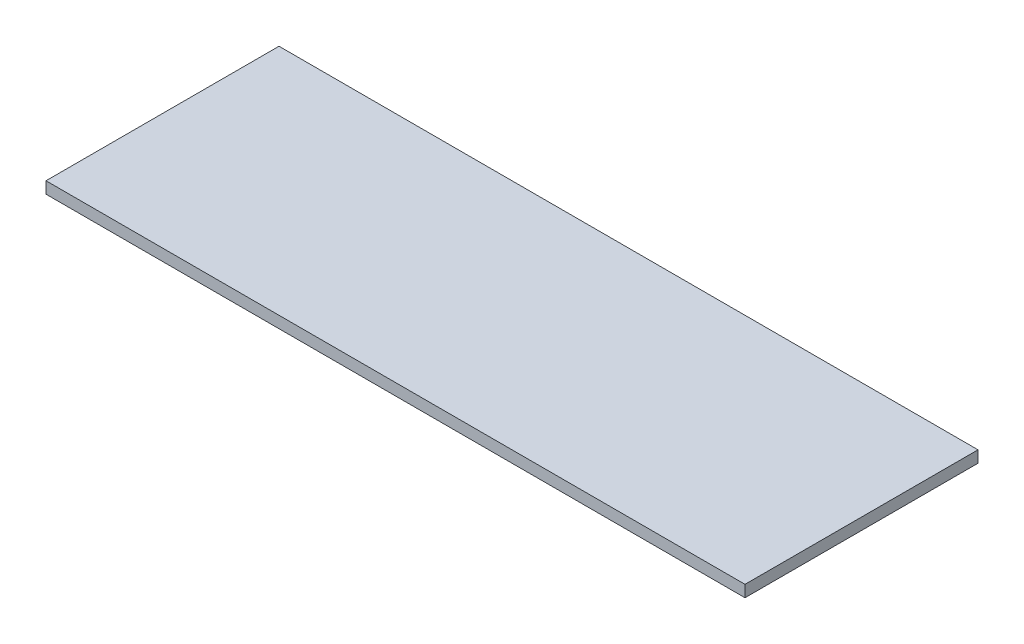
ISO-10303-21;
HEADER;
FILE_DESCRIPTION(('STEP AP214'),'2;1');
FILE_NAME('part.step','',(''),(''),'','','');
FILE_SCHEMA(('AUTOMOTIVE_DESIGN { 1 0 10303 214 1 1 1 1 }'));
ENDSEC;
DATA;
#1=APPLICATION_CONTEXT('core data for automotive mechanical design processes');
#2=APPLICATION_PROTOCOL_DEFINITION('international standard','automotive_design',2000,#1);
#3=PRODUCT_CONTEXT('',#1,'mechanical');
#4=PRODUCT('Part','Part','',(#3));
#5=PRODUCT_RELATED_PRODUCT_CATEGORY('part','',(#4));
#6=PRODUCT_DEFINITION_FORMATION('','',#4);
#7=PRODUCT_DEFINITION_CONTEXT('part definition',#1,'design');
#8=PRODUCT_DEFINITION('design','',#6,#7);
#9=PRODUCT_DEFINITION_SHAPE('','',#8);
#10=(LENGTH_UNIT() NAMED_UNIT(*) SI_UNIT(.MILLI.,.METRE.));
#11=(NAMED_UNIT(*) PLANE_ANGLE_UNIT() SI_UNIT($,.RADIAN.));
#12=(NAMED_UNIT(*) SI_UNIT($,.STERADIAN.) SOLID_ANGLE_UNIT());
#13=UNCERTAINTY_MEASURE_WITH_UNIT(LENGTH_MEASURE(1.E-05),#10,'distance_accuracy_value','');
#14=(GEOMETRIC_REPRESENTATION_CONTEXT(3) GLOBAL_UNCERTAINTY_ASSIGNED_CONTEXT((#13)) GLOBAL_UNIT_ASSIGNED_CONTEXT((#10,
#11,#12)) REPRESENTATION_CONTEXT('',''));
#15=CARTESIAN_POINT('',(0.,0.,0.));
#16=DIRECTION('',(0.,0.,1.));
#17=DIRECTION('',(1.,0.,0.));
#18=AXIS2_PLACEMENT_3D('',#15,#16,#17);
#19=CARTESIAN_POINT('',(0.,5.,0.));
#20=DIRECTION('',(1.,0.,0.));
#21=DIRECTION('',(0.,0.,-1.));
#22=AXIS2_PLACEMENT_3D('',#19,#20,#21);
#23=PLANE('',#22);
#24=DIRECTION('',(0.,0.,1.));
#25=VECTOR('',#24,1.);
#26=CARTESIAN_POINT('',(0.,0.,0.));
#27=LINE('',#26,#25);
#28=CARTESIAN_POINT('',(0.,0.,0.));
#29=VERTEX_POINT('',#28);
#30=CARTESIAN_POINT('',(0.,0.,100.));
#31=VERTEX_POINT('',#30);
#32=EDGE_CURVE('E96',#29,#31,#27,.T.);
#33=ORIENTED_EDGE('',*,*,#32,.T.);
#34=DIRECTION('',(0.,-1.,0.));
#35=VECTOR('',#34,1.);
#36=CARTESIAN_POINT('',(0.,5.,100.));
#37=LINE('',#36,#35);
#38=CARTESIAN_POINT('',(0.,5.,100.));
#39=VERTEX_POINT('',#38);
#40=EDGE_CURVE('E11',#39,#31,#37,.T.);
#41=ORIENTED_EDGE('',*,*,#40,.F.);
#42=DIRECTION('',(0.,0.,1.));
#43=VECTOR('',#42,1.);
#44=CARTESIAN_POINT('',(0.,5.,0.));
#45=LINE('',#44,#43);
#46=CARTESIAN_POINT('',(0.,5.,0.));
#47=VERTEX_POINT('',#46);
#48=EDGE_CURVE('E84',#47,#39,#45,.T.);
#49=ORIENTED_EDGE('',*,*,#48,.F.);
#50=DIRECTION('',(0.,-1.,0.));
#51=VECTOR('',#50,1.);
#52=CARTESIAN_POINT('',(0.,5.,0.));
#53=LINE('',#52,#51);
#54=EDGE_CURVE('E92',#47,#29,#53,.T.);
#55=ORIENTED_EDGE('',*,*,#54,.T.);
#56=EDGE_LOOP('',(#33,#41,#49,#55));
#57=FACE_BOUND('',#56,.T.);
#58=ADVANCED_FACE('F33',(#57),#23,.F.);
#59=CARTESIAN_POINT('',(0.,5.,100.));
#60=DIRECTION('',(0.,0.,-1.));
#61=DIRECTION('',(-1.,0.,0.));
#62=AXIS2_PLACEMENT_3D('',#59,#60,#61);
#63=PLANE('',#62);
#64=DIRECTION('',(1.,0.,0.));
#65=VECTOR('',#64,1.);
#66=CARTESIAN_POINT('',(0.,0.,100.));
#67=LINE('',#66,#65);
#68=CARTESIAN_POINT('',(300.,0.,100.));
#69=VERTEX_POINT('',#68);
#70=EDGE_CURVE('E88',#31,#69,#67,.T.);
#71=ORIENTED_EDGE('',*,*,#70,.T.);
#72=DIRECTION('',(0.,-1.,0.));
#73=VECTOR('',#72,1.);
#74=CARTESIAN_POINT('',(300.,5.,100.));
#75=LINE('',#74,#73);
#76=CARTESIAN_POINT('',(300.,5.,100.));
#77=VERTEX_POINT('',#76);
#78=EDGE_CURVE('E41',#77,#69,#75,.T.);
#79=ORIENTED_EDGE('',*,*,#78,.F.);
#80=DIRECTION('',(1.,0.,0.));
#81=VECTOR('',#80,1.);
#82=CARTESIAN_POINT('',(0.,5.,100.));
#83=LINE('',#82,#81);
#84=EDGE_CURVE('E79',#39,#77,#83,.T.);
#85=ORIENTED_EDGE('',*,*,#84,.F.);
#86=ORIENTED_EDGE('',*,*,#40,.T.);
#87=EDGE_LOOP('',(#71,#79,#85,#86));
#88=FACE_BOUND('',#87,.T.);
#89=ADVANCED_FACE('F87',(#88),#63,.F.);
#90=CARTESIAN_POINT('',(300.,5.,0.));
#91=DIRECTION('',(-1.,0.,0.));
#92=DIRECTION('',(0.,0.,1.));
#93=AXIS2_PLACEMENT_3D('',#90,#91,#92);
#94=PLANE('',#93);
#95=DIRECTION('',(0.,0.,-1.));
#96=VECTOR('',#95,1.);
#97=CARTESIAN_POINT('',(300.,0.,0.));
#98=LINE('',#97,#96);
#99=CARTESIAN_POINT('',(300.,0.,0.));
#100=VERTEX_POINT('',#99);
#101=EDGE_CURVE('E66',#69,#100,#98,.T.);
#102=ORIENTED_EDGE('',*,*,#101,.T.);
#103=DIRECTION('',(0.,-1.,0.));
#104=VECTOR('',#103,1.);
#105=CARTESIAN_POINT('',(300.,5.,0.));
#106=LINE('',#105,#104);
#107=CARTESIAN_POINT('',(300.,5.,0.));
#108=VERTEX_POINT('',#107);
#109=EDGE_CURVE('E89',#108,#100,#106,.T.);
#110=ORIENTED_EDGE('',*,*,#109,.F.);
#111=DIRECTION('',(0.,0.,-1.));
#112=VECTOR('',#111,1.);
#113=CARTESIAN_POINT('',(300.,5.,0.));
#114=LINE('',#113,#112);
#115=EDGE_CURVE('E82',#77,#108,#114,.T.);
#116=ORIENTED_EDGE('',*,*,#115,.F.);
#117=ORIENTED_EDGE('',*,*,#78,.T.);
#118=EDGE_LOOP('',(#102,#110,#116,#117));
#119=FACE_BOUND('',#118,.T.);
#120=ADVANCED_FACE('F90',(#119),#94,.F.);
#121=CARTESIAN_POINT('',(0.,5.,0.));
#122=DIRECTION('',(0.,0.,1.));
#123=DIRECTION('',(1.,0.,0.));
#124=AXIS2_PLACEMENT_3D('',#121,#122,#123);
#125=PLANE('',#124);
#126=DIRECTION('',(-1.,0.,0.));
#127=VECTOR('',#126,1.);
#128=CARTESIAN_POINT('',(0.,0.,0.));
#129=LINE('',#128,#127);
#130=EDGE_CURVE('E72',#100,#29,#129,.T.);
#131=ORIENTED_EDGE('',*,*,#130,.T.);
#132=ORIENTED_EDGE('',*,*,#54,.F.);
#133=DIRECTION('',(-1.,0.,0.));
#134=VECTOR('',#133,1.);
#135=CARTESIAN_POINT('',(0.,5.,0.));
#136=LINE('',#135,#134);
#137=EDGE_CURVE('E49',#108,#47,#136,.T.);
#138=ORIENTED_EDGE('',*,*,#137,.F.);
#139=ORIENTED_EDGE('',*,*,#109,.T.);
#140=EDGE_LOOP('',(#131,#132,#138,#139));
#141=FACE_BOUND('',#140,.T.);
#142=ADVANCED_FACE('F103',(#141),#125,.F.);
#143=CARTESIAN_POINT('',(0.,5.,0.));
#144=DIRECTION('',(0.,1.,0.));
#145=DIRECTION('',(0.,0.,1.));
#146=AXIS2_PLACEMENT_3D('',#143,#144,#145);
#147=PLANE('',#146);
#148=ORIENTED_EDGE('',*,*,#48,.T.);
#149=ORIENTED_EDGE('',*,*,#84,.T.);
#150=ORIENTED_EDGE('',*,*,#115,.T.);
#151=ORIENTED_EDGE('',*,*,#137,.T.);
#152=EDGE_LOOP('',(#148,#149,#150,#151));
#153=FACE_BOUND('',#152,.T.);
#154=ADVANCED_FACE('F80',(#153),#147,.T.);
#155=CARTESIAN_POINT('',(0.,0.,0.));
#156=DIRECTION('',(0.,1.,0.));
#157=DIRECTION('',(0.,0.,1.));
#158=AXIS2_PLACEMENT_3D('',#155,#156,#157);
#159=PLANE('',#158);
#160=ORIENTED_EDGE('',*,*,#32,.F.);
#161=ORIENTED_EDGE('',*,*,#130,.F.);
#162=ORIENTED_EDGE('',*,*,#101,.F.);
#163=ORIENTED_EDGE('',*,*,#70,.F.);
#164=EDGE_LOOP('',(#160,#161,#162,#163));
#165=FACE_BOUND('',#164,.T.);
#166=ADVANCED_FACE('F106',(#165),#159,.F.);
#167=CLOSED_SHELL('',(#58,#89,#120,#142,#154,#166));
#168=MANIFOLD_SOLID_BREP('B2',#167);
#169=ADVANCED_BREP_SHAPE_REPRESENTATION('',(#18,#168),#14);
#170=SHAPE_DEFINITION_REPRESENTATION(#9,#169);
ENDSEC;
END-ISO-10303-21;
